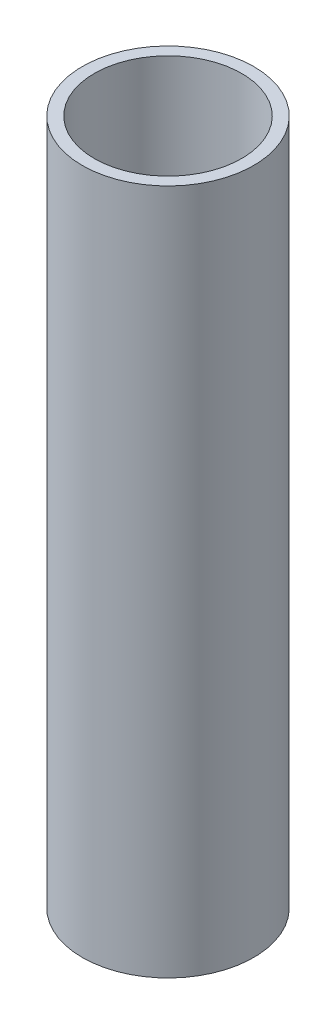
ISO-10303-21;
HEADER;
FILE_DESCRIPTION(('STEP AP214'),'2;1');
FILE_NAME('part.step','',(''),(''),'','','');
FILE_SCHEMA(('AUTOMOTIVE_DESIGN { 1 0 10303 214 1 1 1 1 }'));
ENDSEC;
DATA;
#1=APPLICATION_CONTEXT('core data for automotive mechanical design processes');
#2=APPLICATION_PROTOCOL_DEFINITION('international standard','automotive_design',2000,#1);
#3=PRODUCT_CONTEXT('',#1,'mechanical');
#4=PRODUCT('Part','Part','',(#3));
#5=PRODUCT_RELATED_PRODUCT_CATEGORY('part','',(#4));
#6=PRODUCT_DEFINITION_FORMATION('','',#4);
#7=PRODUCT_DEFINITION_CONTEXT('part definition',#1,'design');
#8=PRODUCT_DEFINITION('design','',#6,#7);
#9=PRODUCT_DEFINITION_SHAPE('','',#8);
#10=(LENGTH_UNIT() NAMED_UNIT(*) SI_UNIT(.MILLI.,.METRE.));
#11=(NAMED_UNIT(*) PLANE_ANGLE_UNIT() SI_UNIT($,.RADIAN.));
#12=(NAMED_UNIT(*) SI_UNIT($,.STERADIAN.) SOLID_ANGLE_UNIT());
#13=UNCERTAINTY_MEASURE_WITH_UNIT(LENGTH_MEASURE(1.E-05),#10,'distance_accuracy_value','');
#14=(GEOMETRIC_REPRESENTATION_CONTEXT(3) GLOBAL_UNCERTAINTY_ASSIGNED_CONTEXT((#13)) GLOBAL_UNIT_ASSIGNED_CONTEXT((#10,
#11,#12)) REPRESENTATION_CONTEXT('',''));
#15=CARTESIAN_POINT('',(0.,0.,0.));
#16=DIRECTION('',(0.,0.,1.));
#17=DIRECTION('',(1.,0.,0.));
#18=AXIS2_PLACEMENT_3D('',#15,#16,#17);
#19=CARTESIAN_POINT('',(0.,200.,0.));
#20=DIRECTION('',(0.,1.,0.));
#21=DIRECTION('',(0.,0.,1.));
#22=AXIS2_PLACEMENT_3D('',#19,#20,#21);
#23=PLANE('',#22);
#24=CARTESIAN_POINT('',(0.,200.,0.));
#25=DIRECTION('',(0.,1.,0.));
#26=DIRECTION('',(0.,0.,1.));
#27=AXIS2_PLACEMENT_3D('',#24,#25,#26);
#28=CIRCLE('',#27,25.);
#29=CARTESIAN_POINT('',(0.,200.,25.));
#30=VERTEX_POINT('',#29);
#31=EDGE_CURVE('E10',#30,#30,#28,.T.);
#32=ORIENTED_EDGE('',*,*,#31,.T.);
#33=EDGE_LOOP('',(#32));
#34=FACE_BOUND('',#33,.T.);
#35=CARTESIAN_POINT('',(0.,200.,0.));
#36=DIRECTION('',(0.,1.,0.));
#37=DIRECTION('',(0.,0.,1.));
#38=AXIS2_PLACEMENT_3D('',#35,#36,#37);
#39=CIRCLE('',#38,21.5);
#40=CARTESIAN_POINT('',(0.,200.,21.5));
#41=VERTEX_POINT('',#40);
#42=EDGE_CURVE('E44',#41,#41,#39,.T.);
#43=ORIENTED_EDGE('',*,*,#42,.F.);
#44=EDGE_LOOP('',(#43));
#45=FACE_BOUND('',#44,.T.);
#46=ADVANCED_FACE('F33',(#34,#45),#23,.T.);
#47=CARTESIAN_POINT('',(0.,0.,0.));
#48=DIRECTION('',(0.,1.,0.));
#49=DIRECTION('',(0.,0.,1.));
#50=AXIS2_PLACEMENT_3D('',#47,#48,#49);
#51=PLANE('',#50);
#52=CARTESIAN_POINT('',(0.,0.,0.));
#53=DIRECTION('',(0.,1.,0.));
#54=DIRECTION('',(0.,0.,1.));
#55=AXIS2_PLACEMENT_3D('',#52,#53,#54);
#56=CIRCLE('',#55,25.);
#57=CARTESIAN_POINT('',(0.,0.,25.));
#58=VERTEX_POINT('',#57);
#59=EDGE_CURVE('E37',#58,#58,#56,.T.);
#60=ORIENTED_EDGE('',*,*,#59,.F.);
#61=EDGE_LOOP('',(#60));
#62=FACE_BOUND('',#61,.T.);
#63=CARTESIAN_POINT('',(0.,0.,0.));
#64=DIRECTION('',(0.,1.,0.));
#65=DIRECTION('',(0.,0.,1.));
#66=AXIS2_PLACEMENT_3D('',#63,#64,#65);
#67=CIRCLE('',#66,21.5);
#68=CARTESIAN_POINT('',(0.,0.,21.5));
#69=VERTEX_POINT('',#68);
#70=EDGE_CURVE('E46',#69,#69,#67,.T.);
#71=ORIENTED_EDGE('',*,*,#70,.T.);
#72=EDGE_LOOP('',(#71));
#73=FACE_BOUND('',#72,.T.);
#74=ADVANCED_FACE('F56',(#62,#73),#51,.F.);
#75=CARTESIAN_POINT('',(0.,200.,0.));
#76=DIRECTION('',(0.,-1.,0.));
#77=DIRECTION('',(0.,0.,-1.));
#78=AXIS2_PLACEMENT_3D('',#75,#76,#77);
#79=CYLINDRICAL_SURFACE('',#78,25.);
#80=ORIENTED_EDGE('',*,*,#31,.F.);
#81=EDGE_LOOP('',(#80));
#82=FACE_BOUND('',#81,.T.);
#83=ORIENTED_EDGE('',*,*,#59,.T.);
#84=EDGE_LOOP('',(#83));
#85=FACE_BOUND('',#84,.T.);
#86=ADVANCED_FACE('F35',(#82,#85),#79,.T.);
#87=CARTESIAN_POINT('',(0.,200.,0.));
#88=DIRECTION('',(0.,-1.,0.));
#89=DIRECTION('',(0.,0.,-1.));
#90=AXIS2_PLACEMENT_3D('',#87,#88,#89);
#91=CYLINDRICAL_SURFACE('',#90,21.5);
#92=ORIENTED_EDGE('',*,*,#42,.T.);
#93=EDGE_LOOP('',(#92));
#94=FACE_BOUND('',#93,.T.);
#95=ORIENTED_EDGE('',*,*,#70,.F.);
#96=EDGE_LOOP('',(#95));
#97=FACE_BOUND('',#96,.T.);
#98=ADVANCED_FACE('F52',(#94,#97),#91,.F.);
#99=CLOSED_SHELL('',(#46,#74,#86,#98));
#100=MANIFOLD_SOLID_BREP('B2',#99);
#101=ADVANCED_BREP_SHAPE_REPRESENTATION('',(#18,#100),#14);
#102=SHAPE_DEFINITION_REPRESENTATION(#9,#101);
ENDSEC;
END-ISO-10303-21;
